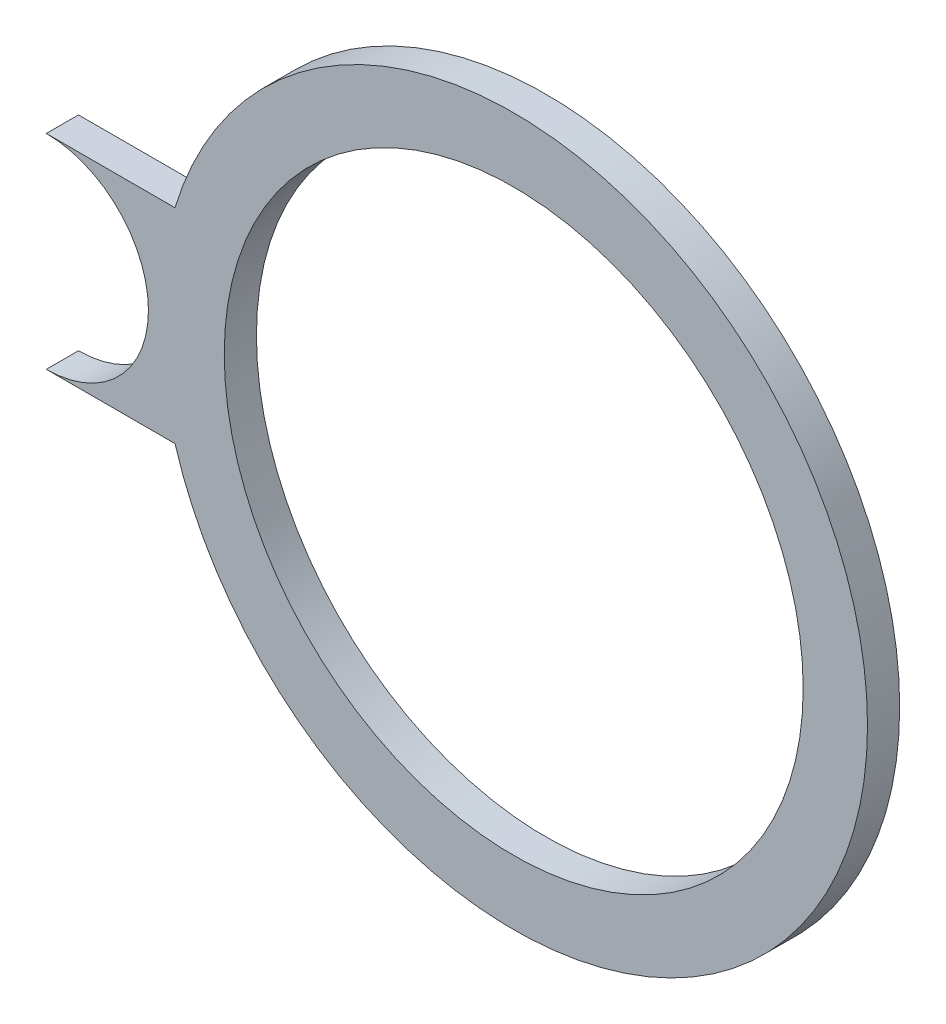
ISO-10303-21;
HEADER;
FILE_DESCRIPTION(('STEP AP214'),'2;1');
FILE_NAME('part.step','',(''),(''),'','','');
FILE_SCHEMA(('AUTOMOTIVE_DESIGN { 1 0 10303 214 1 1 1 1 }'));
ENDSEC;
DATA;
#1=APPLICATION_CONTEXT('core data for automotive mechanical design processes');
#2=APPLICATION_PROTOCOL_DEFINITION('international standard','automotive_design',2000,#1);
#3=PRODUCT_CONTEXT('',#1,'mechanical');
#4=PRODUCT('Part','Part','',(#3));
#5=PRODUCT_RELATED_PRODUCT_CATEGORY('part','',(#4));
#6=PRODUCT_DEFINITION_FORMATION('','',#4);
#7=PRODUCT_DEFINITION_CONTEXT('part definition',#1,'design');
#8=PRODUCT_DEFINITION('design','',#6,#7);
#9=PRODUCT_DEFINITION_SHAPE('','',#8);
#10=(LENGTH_UNIT() NAMED_UNIT(*) SI_UNIT(.MILLI.,.METRE.));
#11=(NAMED_UNIT(*) PLANE_ANGLE_UNIT() SI_UNIT($,.RADIAN.));
#12=(NAMED_UNIT(*) SI_UNIT($,.STERADIAN.) SOLID_ANGLE_UNIT());
#13=UNCERTAINTY_MEASURE_WITH_UNIT(LENGTH_MEASURE(1.E-05),#10,'distance_accuracy_value','');
#14=(GEOMETRIC_REPRESENTATION_CONTEXT(3) GLOBAL_UNCERTAINTY_ASSIGNED_CONTEXT((#13)) GLOBAL_UNIT_ASSIGNED_CONTEXT((#10,
#11,#12)) REPRESENTATION_CONTEXT('',''));
#15=CARTESIAN_POINT('',(0.,0.,0.));
#16=DIRECTION('',(0.,0.,1.));
#17=DIRECTION('',(1.,0.,0.));
#18=AXIS2_PLACEMENT_3D('',#15,#16,#17);
#19=CARTESIAN_POINT('',(0.,0.,5.));
#20=DIRECTION('',(0.,0.,1.));
#21=DIRECTION('',(1.,0.,0.));
#22=AXIS2_PLACEMENT_3D('',#19,#20,#21);
#23=PLANE('',#22);
#24=DIRECTION('',(1.,0.,0.));
#25=VECTOR('',#24,1.);
#26=CARTESIAN_POINT('',(-72.659133823108,-15.875,5.));
#27=LINE('',#26,#25);
#28=CARTESIAN_POINT('',(-72.659133823108,-15.875,5.));
#29=VERTEX_POINT('',#28);
#30=CARTESIAN_POINT('',(-52.659133823108,-15.875,5.));
#31=VERTEX_POINT('',#30);
#32=EDGE_CURVE('E111',#29,#31,#27,.T.);
#33=ORIENTED_EDGE('',*,*,#32,.T.);
#34=CARTESIAN_POINT('',(0.,0.,5.));
#35=DIRECTION('',(0.,0.,1.));
#36=DIRECTION('',(1.,0.,0.));
#37=AXIS2_PLACEMENT_3D('',#34,#35,#36);
#38=CIRCLE('',#37,55.);
#39=CARTESIAN_POINT('',(-52.659133823108,15.875,5.));
#40=VERTEX_POINT('',#39);
#41=EDGE_CURVE('E104',#31,#40,#38,.T.);
#42=ORIENTED_EDGE('',*,*,#41,.T.);
#43=DIRECTION('',(-1.,0.,0.));
#44=VECTOR('',#43,1.);
#45=CARTESIAN_POINT('',(-52.659133823108,15.875,5.));
#46=LINE('',#45,#44);
#47=CARTESIAN_POINT('',(-72.659133823108,15.875,5.));
#48=VERTEX_POINT('',#47);
#49=EDGE_CURVE('E110',#40,#48,#46,.T.);
#50=ORIENTED_EDGE('',*,*,#49,.T.);
#51=CARTESIAN_POINT('',(-72.659133823108,0.,5.));
#52=DIRECTION('',(0.,0.,1.));
#53=DIRECTION('',(1.,0.,0.));
#54=AXIS2_PLACEMENT_3D('',#51,#52,#53);
#55=CIRCLE('',#54,15.875);
#56=EDGE_CURVE('E123',#29,#48,#55,.T.);
#57=ORIENTED_EDGE('',*,*,#56,.F.);
#58=EDGE_LOOP('',(#33,#42,#50,#57));
#59=FACE_BOUND('',#58,.T.);
#60=CARTESIAN_POINT('',(0.,0.,5.));
#61=DIRECTION('',(0.,0.,1.));
#62=DIRECTION('',(1.,0.,0.));
#63=AXIS2_PLACEMENT_3D('',#60,#61,#62);
#64=CIRCLE('',#63,45.);
#65=CARTESIAN_POINT('',(45.,0.,5.));
#66=VERTEX_POINT('',#65);
#67=EDGE_CURVE('E132',#66,#66,#64,.T.);
#68=ORIENTED_EDGE('',*,*,#67,.F.);
#69=EDGE_LOOP('',(#68));
#70=FACE_BOUND('',#69,.T.);
#71=ADVANCED_FACE('F60',(#59,#70),#23,.T.);
#72=CARTESIAN_POINT('',(0.,0.,0.));
#73=DIRECTION('',(0.,0.,1.));
#74=DIRECTION('',(1.,0.,0.));
#75=AXIS2_PLACEMENT_3D('',#72,#73,#74);
#76=PLANE('',#75);
#77=DIRECTION('',(1.,0.,0.));
#78=VECTOR('',#77,1.);
#79=CARTESIAN_POINT('',(-72.659133823108,-15.875,0.));
#80=LINE('',#79,#78);
#81=CARTESIAN_POINT('',(-72.659133823108,-15.875,0.));
#82=VERTEX_POINT('',#81);
#83=CARTESIAN_POINT('',(-52.659133823108,-15.875,0.));
#84=VERTEX_POINT('',#83);
#85=EDGE_CURVE('E129',#82,#84,#80,.T.);
#86=ORIENTED_EDGE('',*,*,#85,.F.);
#87=CARTESIAN_POINT('',(-72.659133823108,0.,0.));
#88=DIRECTION('',(0.,0.,1.));
#89=DIRECTION('',(1.,0.,0.));
#90=AXIS2_PLACEMENT_3D('',#87,#88,#89);
#91=CIRCLE('',#90,15.875);
#92=CARTESIAN_POINT('',(-72.659133823108,15.875,0.));
#93=VERTEX_POINT('',#92);
#94=EDGE_CURVE('E138',#82,#93,#91,.T.);
#95=ORIENTED_EDGE('',*,*,#94,.T.);
#96=DIRECTION('',(-1.,0.,0.));
#97=VECTOR('',#96,1.);
#98=CARTESIAN_POINT('',(-52.659133823108,15.875,0.));
#99=LINE('',#98,#97);
#100=CARTESIAN_POINT('',(-52.659133823108,15.875,0.));
#101=VERTEX_POINT('',#100);
#102=EDGE_CURVE('E135',#101,#93,#99,.T.);
#103=ORIENTED_EDGE('',*,*,#102,.F.);
#104=CARTESIAN_POINT('',(0.,0.,0.));
#105=DIRECTION('',(0.,0.,1.));
#106=DIRECTION('',(1.,0.,0.));
#107=AXIS2_PLACEMENT_3D('',#104,#105,#106);
#108=CIRCLE('',#107,55.);
#109=EDGE_CURVE('E117',#84,#101,#108,.T.);
#110=ORIENTED_EDGE('',*,*,#109,.F.);
#111=EDGE_LOOP('',(#86,#95,#103,#110));
#112=FACE_BOUND('',#111,.T.);
#113=CARTESIAN_POINT('',(0.,0.,0.));
#114=DIRECTION('',(0.,0.,1.));
#115=DIRECTION('',(1.,0.,0.));
#116=AXIS2_PLACEMENT_3D('',#113,#114,#115);
#117=CIRCLE('',#116,45.);
#118=CARTESIAN_POINT('',(45.,0.,0.));
#119=VERTEX_POINT('',#118);
#120=EDGE_CURVE('E148',#119,#119,#117,.T.);
#121=ORIENTED_EDGE('',*,*,#120,.T.);
#122=EDGE_LOOP('',(#121));
#123=FACE_BOUND('',#122,.T.);
#124=ADVANCED_FACE('F159',(#112,#123),#76,.F.);
#125=CARTESIAN_POINT('',(-72.659133823108,-15.875,5.));
#126=DIRECTION('',(0.,1.,0.));
#127=DIRECTION('',(-1.,0.,0.));
#128=AXIS2_PLACEMENT_3D('',#125,#126,#127);
#129=PLANE('',#128);
#130=ORIENTED_EDGE('',*,*,#85,.T.);
#131=DIRECTION('',(0.,0.,-1.));
#132=VECTOR('',#131,1.);
#133=CARTESIAN_POINT('',(-52.659133823108,-15.875,5.));
#134=LINE('',#133,#132);
#135=EDGE_CURVE('E12',#31,#84,#134,.T.);
#136=ORIENTED_EDGE('',*,*,#135,.F.);
#137=ORIENTED_EDGE('',*,*,#32,.F.);
#138=DIRECTION('',(0.,0.,-1.));
#139=VECTOR('',#138,1.);
#140=CARTESIAN_POINT('',(-72.659133823108,-15.875,5.));
#141=LINE('',#140,#139);
#142=EDGE_CURVE('E78',#29,#82,#141,.T.);
#143=ORIENTED_EDGE('',*,*,#142,.T.);
#144=EDGE_LOOP('',(#130,#136,#137,#143));
#145=FACE_BOUND('',#144,.T.);
#146=ADVANCED_FACE('F62',(#145),#129,.F.);
#147=CARTESIAN_POINT('',(0.,0.,5.));
#148=DIRECTION('',(0.,0.,-1.));
#149=DIRECTION('',(-1.,0.,0.));
#150=AXIS2_PLACEMENT_3D('',#147,#148,#149);
#151=CYLINDRICAL_SURFACE('',#150,55.);
#152=ORIENTED_EDGE('',*,*,#109,.T.);
#153=DIRECTION('',(0.,0.,-1.));
#154=VECTOR('',#153,1.);
#155=CARTESIAN_POINT('',(-52.659133823108,15.875,5.));
#156=LINE('',#155,#154);
#157=EDGE_CURVE('E70',#40,#101,#156,.T.);
#158=ORIENTED_EDGE('',*,*,#157,.F.);
#159=ORIENTED_EDGE('',*,*,#41,.F.);
#160=ORIENTED_EDGE('',*,*,#135,.T.);
#161=EDGE_LOOP('',(#152,#158,#159,#160));
#162=FACE_BOUND('',#161,.T.);
#163=ADVANCED_FACE('F116',(#162),#151,.T.);
#164=CARTESIAN_POINT('',(-52.659133823108,15.875,5.));
#165=DIRECTION('',(0.,-1.,0.));
#166=DIRECTION('',(1.,0.,0.));
#167=AXIS2_PLACEMENT_3D('',#164,#165,#166);
#168=PLANE('',#167);
#169=ORIENTED_EDGE('',*,*,#102,.T.);
#170=DIRECTION('',(0.,0.,-1.));
#171=VECTOR('',#170,1.);
#172=CARTESIAN_POINT('',(-72.659133823108,15.875,5.));
#173=LINE('',#172,#171);
#174=EDGE_CURVE('E93',#48,#93,#173,.T.);
#175=ORIENTED_EDGE('',*,*,#174,.F.);
#176=ORIENTED_EDGE('',*,*,#49,.F.);
#177=ORIENTED_EDGE('',*,*,#157,.T.);
#178=EDGE_LOOP('',(#169,#175,#176,#177));
#179=FACE_BOUND('',#178,.T.);
#180=ADVANCED_FACE('F121',(#179),#168,.F.);
#181=CARTESIAN_POINT('',(-72.659133823108,0.,5.));
#182=DIRECTION('',(0.,0.,-1.));
#183=DIRECTION('',(-1.,0.,0.));
#184=AXIS2_PLACEMENT_3D('',#181,#182,#183);
#185=CYLINDRICAL_SURFACE('',#184,15.875);
#186=ORIENTED_EDGE('',*,*,#94,.F.);
#187=ORIENTED_EDGE('',*,*,#142,.F.);
#188=ORIENTED_EDGE('',*,*,#56,.T.);
#189=ORIENTED_EDGE('',*,*,#174,.T.);
#190=EDGE_LOOP('',(#186,#187,#188,#189));
#191=FACE_BOUND('',#190,.T.);
#192=ADVANCED_FACE('F167',(#191),#185,.F.);
#193=CARTESIAN_POINT('',(0.,0.,5.));
#194=DIRECTION('',(0.,0.,-1.));
#195=DIRECTION('',(-1.,0.,0.));
#196=AXIS2_PLACEMENT_3D('',#193,#194,#195);
#197=CYLINDRICAL_SURFACE('',#196,45.);
#198=ORIENTED_EDGE('',*,*,#67,.T.);
#199=EDGE_LOOP('',(#198));
#200=FACE_BOUND('',#199,.T.);
#201=ORIENTED_EDGE('',*,*,#120,.F.);
#202=EDGE_LOOP('',(#201));
#203=FACE_BOUND('',#202,.T.);
#204=ADVANCED_FACE('F156',(#200,#203),#197,.F.);
#205=CLOSED_SHELL('',(#71,#124,#146,#163,#180,#192,#204));
#206=MANIFOLD_SOLID_BREP('B2',#205);
#207=ADVANCED_BREP_SHAPE_REPRESENTATION('',(#18,#206),#14);
#208=SHAPE_DEFINITION_REPRESENTATION(#9,#207);
ENDSEC;
END-ISO-10303-21;
